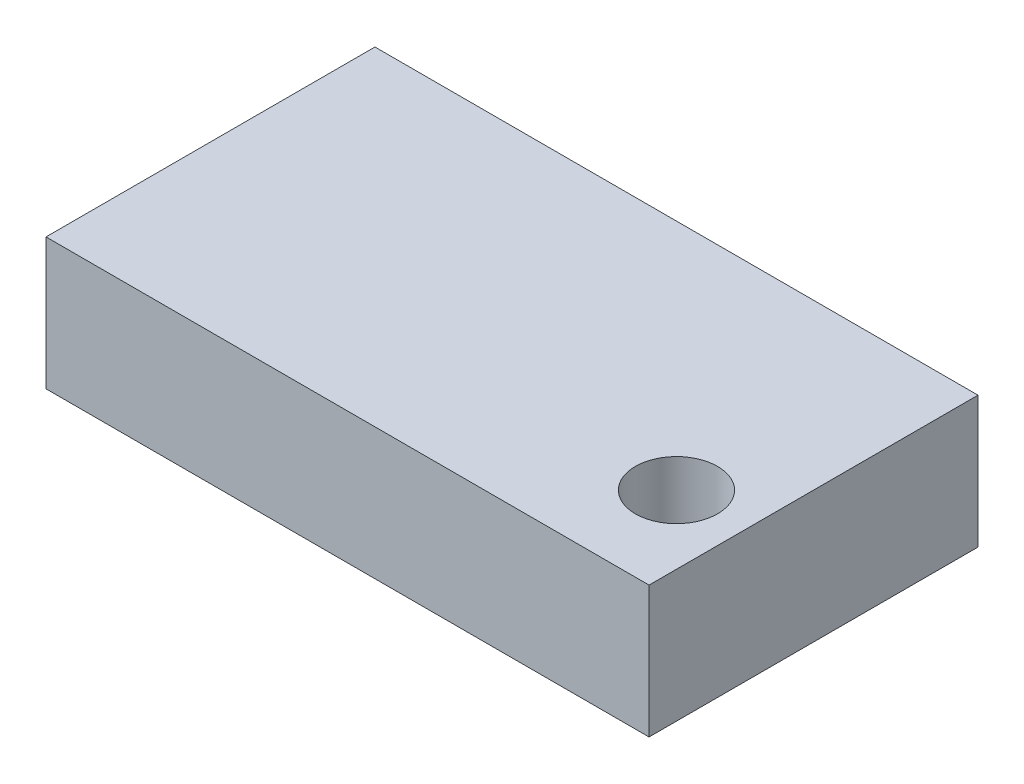
ISO-10303-21;
HEADER;
FILE_DESCRIPTION(('STEP AP214'),'2;1');
FILE_NAME('part.step','',(''),(''),'','','');
FILE_SCHEMA(('AUTOMOTIVE_DESIGN { 1 0 10303 214 1 1 1 1 }'));
ENDSEC;
DATA;
#1=APPLICATION_CONTEXT('core data for automotive mechanical design processes');
#2=APPLICATION_PROTOCOL_DEFINITION('international standard','automotive_design',2000,#1);
#3=PRODUCT_CONTEXT('',#1,'mechanical');
#4=PRODUCT('Part','Part','',(#3));
#5=PRODUCT_RELATED_PRODUCT_CATEGORY('part','',(#4));
#6=PRODUCT_DEFINITION_FORMATION('','',#4);
#7=PRODUCT_DEFINITION_CONTEXT('part definition',#1,'design');
#8=PRODUCT_DEFINITION('design','',#6,#7);
#9=PRODUCT_DEFINITION_SHAPE('','',#8);
#10=(LENGTH_UNIT() NAMED_UNIT(*) SI_UNIT(.MILLI.,.METRE.));
#11=(NAMED_UNIT(*) PLANE_ANGLE_UNIT() SI_UNIT($,.RADIAN.));
#12=(NAMED_UNIT(*) SI_UNIT($,.STERADIAN.) SOLID_ANGLE_UNIT());
#13=UNCERTAINTY_MEASURE_WITH_UNIT(LENGTH_MEASURE(1.E-05),#10,'distance_accuracy_value','');
#14=(GEOMETRIC_REPRESENTATION_CONTEXT(3) GLOBAL_UNCERTAINTY_ASSIGNED_CONTEXT((#13)) GLOBAL_UNIT_ASSIGNED_CONTEXT((#10,
#11,#12)) REPRESENTATION_CONTEXT('',''));
#15=CARTESIAN_POINT('',(0.,0.,0.));
#16=DIRECTION('',(0.,0.,1.));
#17=DIRECTION('',(1.,0.,0.));
#18=AXIS2_PLACEMENT_3D('',#15,#16,#17);
#19=CARTESIAN_POINT('',(0.,4.8,0.));
#20=DIRECTION('',(0.,-1.,0.));
#21=DIRECTION('',(0.,0.,-1.));
#22=AXIS2_PLACEMENT_3D('',#19,#20,#21);
#23=PLANE('',#22);
#24=DIRECTION('',(0.,0.,-1.));
#25=VECTOR('',#24,1.);
#26=CARTESIAN_POINT('',(11.,4.8,6.));
#27=LINE('',#26,#25);
#28=CARTESIAN_POINT('',(11.,4.8,6.));
#29=VERTEX_POINT('',#28);
#30=CARTESIAN_POINT('',(11.,4.8,-6.));
#31=VERTEX_POINT('',#30);
#32=EDGE_CURVE('E92',#29,#31,#27,.T.);
#33=ORIENTED_EDGE('',*,*,#32,.T.);
#34=DIRECTION('',(-1.,0.,0.));
#35=VECTOR('',#34,1.);
#36=CARTESIAN_POINT('',(-11.,4.8,-6.));
#37=LINE('',#36,#35);
#38=CARTESIAN_POINT('',(-11.,4.8,-6.));
#39=VERTEX_POINT('',#38);
#40=EDGE_CURVE('E87',#31,#39,#37,.T.);
#41=ORIENTED_EDGE('',*,*,#40,.T.);
#42=DIRECTION('',(0.,0.,1.));
#43=VECTOR('',#42,1.);
#44=CARTESIAN_POINT('',(-11.,4.8,6.));
#45=LINE('',#44,#43);
#46=CARTESIAN_POINT('',(-11.,4.8,6.));
#47=VERTEX_POINT('',#46);
#48=EDGE_CURVE('E90',#39,#47,#45,.T.);
#49=ORIENTED_EDGE('',*,*,#48,.T.);
#50=DIRECTION('',(1.,0.,0.));
#51=VECTOR('',#50,1.);
#52=CARTESIAN_POINT('',(-11.,4.8,6.));
#53=LINE('',#52,#51);
#54=EDGE_CURVE('E57',#47,#29,#53,.T.);
#55=ORIENTED_EDGE('',*,*,#54,.T.);
#56=EDGE_LOOP('',(#33,#41,#49,#55));
#57=FACE_BOUND('',#56,.T.);
#58=CARTESIAN_POINT('',(8.5,4.8,2.5));
#59=DIRECTION('',(0.,1.,0.));
#60=DIRECTION('',(0.,0.,1.));
#61=AXIS2_PLACEMENT_3D('',#58,#59,#60);
#62=CIRCLE('',#61,1.5);
#63=CARTESIAN_POINT('',(8.5,4.8,4.));
#64=VERTEX_POINT('',#63);
#65=EDGE_CURVE('E112',#64,#64,#62,.T.);
#66=ORIENTED_EDGE('',*,*,#65,.F.);
#67=EDGE_LOOP('',(#66));
#68=FACE_BOUND('',#67,.T.);
#69=ADVANCED_FACE('F39',(#57,#68),#23,.F.);
#70=CARTESIAN_POINT('',(0.,0.,0.));
#71=DIRECTION('',(0.,-1.,0.));
#72=DIRECTION('',(0.,0.,-1.));
#73=AXIS2_PLACEMENT_3D('',#70,#71,#72);
#74=PLANE('',#73);
#75=DIRECTION('',(0.,0.,-1.));
#76=VECTOR('',#75,1.);
#77=CARTESIAN_POINT('',(11.,0.,6.));
#78=LINE('',#77,#76);
#79=CARTESIAN_POINT('',(11.,0.,6.));
#80=VERTEX_POINT('',#79);
#81=CARTESIAN_POINT('',(11.,0.,-6.));
#82=VERTEX_POINT('',#81);
#83=EDGE_CURVE('E108',#80,#82,#78,.T.);
#84=ORIENTED_EDGE('',*,*,#83,.F.);
#85=DIRECTION('',(1.,0.,0.));
#86=VECTOR('',#85,1.);
#87=CARTESIAN_POINT('',(-11.,0.,6.));
#88=LINE('',#87,#86);
#89=CARTESIAN_POINT('',(-11.,0.,6.));
#90=VERTEX_POINT('',#89);
#91=EDGE_CURVE('E80',#90,#80,#88,.T.);
#92=ORIENTED_EDGE('',*,*,#91,.F.);
#93=DIRECTION('',(0.,0.,1.));
#94=VECTOR('',#93,1.);
#95=CARTESIAN_POINT('',(-11.,0.,6.));
#96=LINE('',#95,#94);
#97=CARTESIAN_POINT('',(-11.,0.,-6.));
#98=VERTEX_POINT('',#97);
#99=EDGE_CURVE('E74',#98,#90,#96,.T.);
#100=ORIENTED_EDGE('',*,*,#99,.F.);
#101=DIRECTION('',(-1.,0.,0.));
#102=VECTOR('',#101,1.);
#103=CARTESIAN_POINT('',(-11.,0.,-6.));
#104=LINE('',#103,#102);
#105=EDGE_CURVE('E97',#82,#98,#104,.T.);
#106=ORIENTED_EDGE('',*,*,#105,.F.);
#107=EDGE_LOOP('',(#84,#92,#100,#106));
#108=FACE_BOUND('',#107,.T.);
#109=CARTESIAN_POINT('',(8.5,0.,2.5));
#110=DIRECTION('',(0.,1.,0.));
#111=DIRECTION('',(0.,0.,1.));
#112=AXIS2_PLACEMENT_3D('',#109,#110,#111);
#113=CIRCLE('',#112,1.5);
#114=CARTESIAN_POINT('',(8.5,0.,4.));
#115=VERTEX_POINT('',#114);
#116=EDGE_CURVE('E130',#115,#115,#113,.T.);
#117=ORIENTED_EDGE('',*,*,#116,.T.);
#118=EDGE_LOOP('',(#117));
#119=FACE_BOUND('',#118,.T.);
#120=ADVANCED_FACE('F125',(#108,#119),#74,.T.);
#121=CARTESIAN_POINT('',(11.,4.8,6.));
#122=DIRECTION('',(-1.,0.,0.));
#123=DIRECTION('',(0.,0.,1.));
#124=AXIS2_PLACEMENT_3D('',#121,#122,#123);
#125=PLANE('',#124);
#126=ORIENTED_EDGE('',*,*,#83,.T.);
#127=DIRECTION('',(0.,-1.,0.));
#128=VECTOR('',#127,1.);
#129=CARTESIAN_POINT('',(11.,4.8,-6.));
#130=LINE('',#129,#128);
#131=EDGE_CURVE('E11',#31,#82,#130,.T.);
#132=ORIENTED_EDGE('',*,*,#131,.F.);
#133=ORIENTED_EDGE('',*,*,#32,.F.);
#134=DIRECTION('',(0.,-1.,0.));
#135=VECTOR('',#134,1.);
#136=CARTESIAN_POINT('',(11.,4.8,6.));
#137=LINE('',#136,#135);
#138=EDGE_CURVE('E104',#29,#80,#137,.T.);
#139=ORIENTED_EDGE('',*,*,#138,.T.);
#140=EDGE_LOOP('',(#126,#132,#133,#139));
#141=FACE_BOUND('',#140,.T.);
#142=ADVANCED_FACE('F41',(#141),#125,.F.);
#143=CARTESIAN_POINT('',(-11.,4.8,-6.));
#144=DIRECTION('',(0.,0.,1.));
#145=DIRECTION('',(1.,0.,0.));
#146=AXIS2_PLACEMENT_3D('',#143,#144,#145);
#147=PLANE('',#146);
#148=ORIENTED_EDGE('',*,*,#105,.T.);
#149=DIRECTION('',(0.,-1.,0.));
#150=VECTOR('',#149,1.);
#151=CARTESIAN_POINT('',(-11.,4.8,-6.));
#152=LINE('',#151,#150);
#153=EDGE_CURVE('E49',#39,#98,#152,.T.);
#154=ORIENTED_EDGE('',*,*,#153,.F.);
#155=ORIENTED_EDGE('',*,*,#40,.F.);
#156=ORIENTED_EDGE('',*,*,#131,.T.);
#157=EDGE_LOOP('',(#148,#154,#155,#156));
#158=FACE_BOUND('',#157,.T.);
#159=ADVANCED_FACE('F96',(#158),#147,.F.);
#160=CARTESIAN_POINT('',(-11.,4.8,6.));
#161=DIRECTION('',(1.,0.,0.));
#162=DIRECTION('',(0.,0.,-1.));
#163=AXIS2_PLACEMENT_3D('',#160,#161,#162);
#164=PLANE('',#163);
#165=ORIENTED_EDGE('',*,*,#99,.T.);
#166=DIRECTION('',(0.,-1.,0.));
#167=VECTOR('',#166,1.);
#168=CARTESIAN_POINT('',(-11.,4.8,6.));
#169=LINE('',#168,#167);
#170=EDGE_CURVE('E99',#47,#90,#169,.T.);
#171=ORIENTED_EDGE('',*,*,#170,.F.);
#172=ORIENTED_EDGE('',*,*,#48,.F.);
#173=ORIENTED_EDGE('',*,*,#153,.T.);
#174=EDGE_LOOP('',(#165,#171,#172,#173));
#175=FACE_BOUND('',#174,.T.);
#176=ADVANCED_FACE('F100',(#175),#164,.F.);
#177=CARTESIAN_POINT('',(-11.,4.8,6.));
#178=DIRECTION('',(0.,0.,-1.));
#179=DIRECTION('',(-1.,0.,0.));
#180=AXIS2_PLACEMENT_3D('',#177,#178,#179);
#181=PLANE('',#180);
#182=ORIENTED_EDGE('',*,*,#91,.T.);
#183=ORIENTED_EDGE('',*,*,#138,.F.);
#184=ORIENTED_EDGE('',*,*,#54,.F.);
#185=ORIENTED_EDGE('',*,*,#170,.T.);
#186=EDGE_LOOP('',(#182,#183,#184,#185));
#187=FACE_BOUND('',#186,.T.);
#188=ADVANCED_FACE('F122',(#187),#181,.F.);
#189=CARTESIAN_POINT('',(8.5,4.8,2.5));
#190=DIRECTION('',(0.,-1.,0.));
#191=DIRECTION('',(0.,0.,-1.));
#192=AXIS2_PLACEMENT_3D('',#189,#190,#191);
#193=CYLINDRICAL_SURFACE('',#192,1.5);
#194=ORIENTED_EDGE('',*,*,#65,.T.);
#195=EDGE_LOOP('',(#194));
#196=FACE_BOUND('',#195,.T.);
#197=ORIENTED_EDGE('',*,*,#116,.F.);
#198=EDGE_LOOP('',(#197));
#199=FACE_BOUND('',#198,.T.);
#200=ADVANCED_FACE('F138',(#196,#199),#193,.F.);
#201=CLOSED_SHELL('',(#69,#120,#142,#159,#176,#188,#200));
#202=MANIFOLD_SOLID_BREP('B2',#201);
#203=ADVANCED_BREP_SHAPE_REPRESENTATION('',(#18,#202),#14);
#204=SHAPE_DEFINITION_REPRESENTATION(#9,#203);
ENDSEC;
END-ISO-10303-21;
